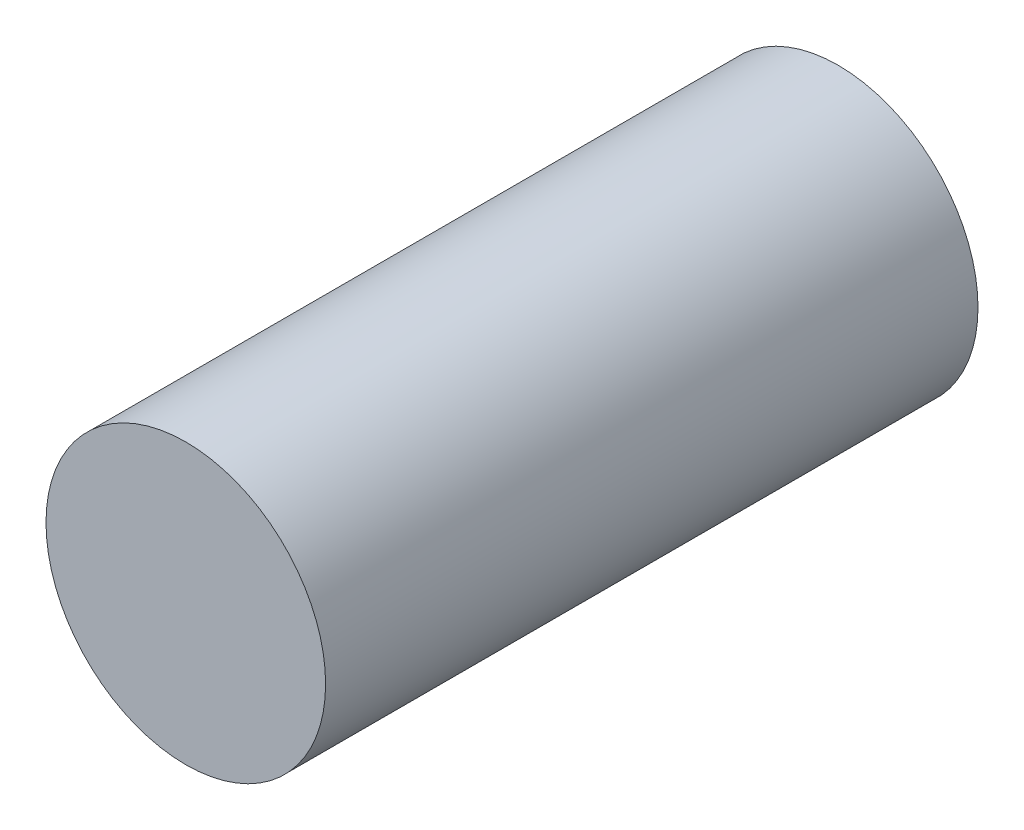
ISO-10303-21;
HEADER;
FILE_DESCRIPTION(('STEP AP214'),'2;1');
FILE_NAME('part.step','',(''),(''),'','','');
FILE_SCHEMA(('AUTOMOTIVE_DESIGN { 1 0 10303 214 1 1 1 1 }'));
ENDSEC;
DATA;
#1=APPLICATION_CONTEXT('core data for automotive mechanical design processes');
#2=APPLICATION_PROTOCOL_DEFINITION('international standard','automotive_design',2000,#1);
#3=PRODUCT_CONTEXT('',#1,'mechanical');
#4=PRODUCT('Part','Part','',(#3));
#5=PRODUCT_RELATED_PRODUCT_CATEGORY('part','',(#4));
#6=PRODUCT_DEFINITION_FORMATION('','',#4);
#7=PRODUCT_DEFINITION_CONTEXT('part definition',#1,'design');
#8=PRODUCT_DEFINITION('design','',#6,#7);
#9=PRODUCT_DEFINITION_SHAPE('','',#8);
#10=(LENGTH_UNIT() NAMED_UNIT(*) SI_UNIT(.MILLI.,.METRE.));
#11=(NAMED_UNIT(*) PLANE_ANGLE_UNIT() SI_UNIT($,.RADIAN.));
#12=(NAMED_UNIT(*) SI_UNIT($,.STERADIAN.) SOLID_ANGLE_UNIT());
#13=UNCERTAINTY_MEASURE_WITH_UNIT(LENGTH_MEASURE(1.E-05),#10,'distance_accuracy_value','');
#14=(GEOMETRIC_REPRESENTATION_CONTEXT(3) GLOBAL_UNCERTAINTY_ASSIGNED_CONTEXT((#13)) GLOBAL_UNIT_ASSIGNED_CONTEXT((#10,
#11,#12)) REPRESENTATION_CONTEXT('',''));
#15=CARTESIAN_POINT('',(0.,0.,0.));
#16=DIRECTION('',(0.,0.,1.));
#17=DIRECTION('',(1.,0.,0.));
#18=AXIS2_PLACEMENT_3D('',#15,#16,#17);
#19=CARTESIAN_POINT('',(0.,0.,14.));
#20=DIRECTION('',(0.,0.,-1.));
#21=DIRECTION('',(-1.,0.,0.));
#22=AXIS2_PLACEMENT_3D('',#19,#20,#21);
#23=CYLINDRICAL_SURFACE('',#22,3.);
#24=CARTESIAN_POINT('',(0.,0.,14.));
#25=DIRECTION('',(0.,0.,1.));
#26=DIRECTION('',(1.,0.,0.));
#27=AXIS2_PLACEMENT_3D('',#24,#25,#26);
#28=CIRCLE('',#27,3.);
#29=CARTESIAN_POINT('',(3.,0.,14.));
#30=VERTEX_POINT('',#29);
#31=EDGE_CURVE('E10',#30,#30,#28,.T.);
#32=ORIENTED_EDGE('',*,*,#31,.F.);
#33=EDGE_LOOP('',(#32));
#34=FACE_BOUND('',#33,.T.);
#35=CARTESIAN_POINT('',(0.,0.,0.));
#36=DIRECTION('',(0.,0.,1.));
#37=DIRECTION('',(1.,0.,0.));
#38=AXIS2_PLACEMENT_3D('',#35,#36,#37);
#39=CIRCLE('',#38,3.);
#40=CARTESIAN_POINT('',(3.,0.,0.));
#41=VERTEX_POINT('',#40);
#42=EDGE_CURVE('E34',#41,#41,#39,.T.);
#43=ORIENTED_EDGE('',*,*,#42,.T.);
#44=EDGE_LOOP('',(#43));
#45=FACE_BOUND('',#44,.T.);
#46=ADVANCED_FACE('F31',(#34,#45),#23,.T.);
#47=CARTESIAN_POINT('',(0.,0.,14.));
#48=DIRECTION('',(0.,0.,1.));
#49=DIRECTION('',(1.,0.,0.));
#50=AXIS2_PLACEMENT_3D('',#47,#48,#49);
#51=PLANE('',#50);
#52=ORIENTED_EDGE('',*,*,#31,.T.);
#53=EDGE_LOOP('',(#52));
#54=FACE_BOUND('',#53,.T.);
#55=ADVANCED_FACE('F46',(#54),#51,.T.);
#56=CARTESIAN_POINT('',(0.,0.,0.));
#57=DIRECTION('',(0.,0.,1.));
#58=DIRECTION('',(1.,0.,0.));
#59=AXIS2_PLACEMENT_3D('',#56,#57,#58);
#60=PLANE('',#59);
#61=ORIENTED_EDGE('',*,*,#42,.F.);
#62=EDGE_LOOP('',(#61));
#63=FACE_BOUND('',#62,.T.);
#64=ADVANCED_FACE('F44',(#63),#60,.F.);
#65=CLOSED_SHELL('',(#46,#55,#64));
#66=MANIFOLD_SOLID_BREP('B2',#65);
#67=ADVANCED_BREP_SHAPE_REPRESENTATION('',(#18,#66),#14);
#68=SHAPE_DEFINITION_REPRESENTATION(#9,#67);
ENDSEC;
END-ISO-10303-21;
